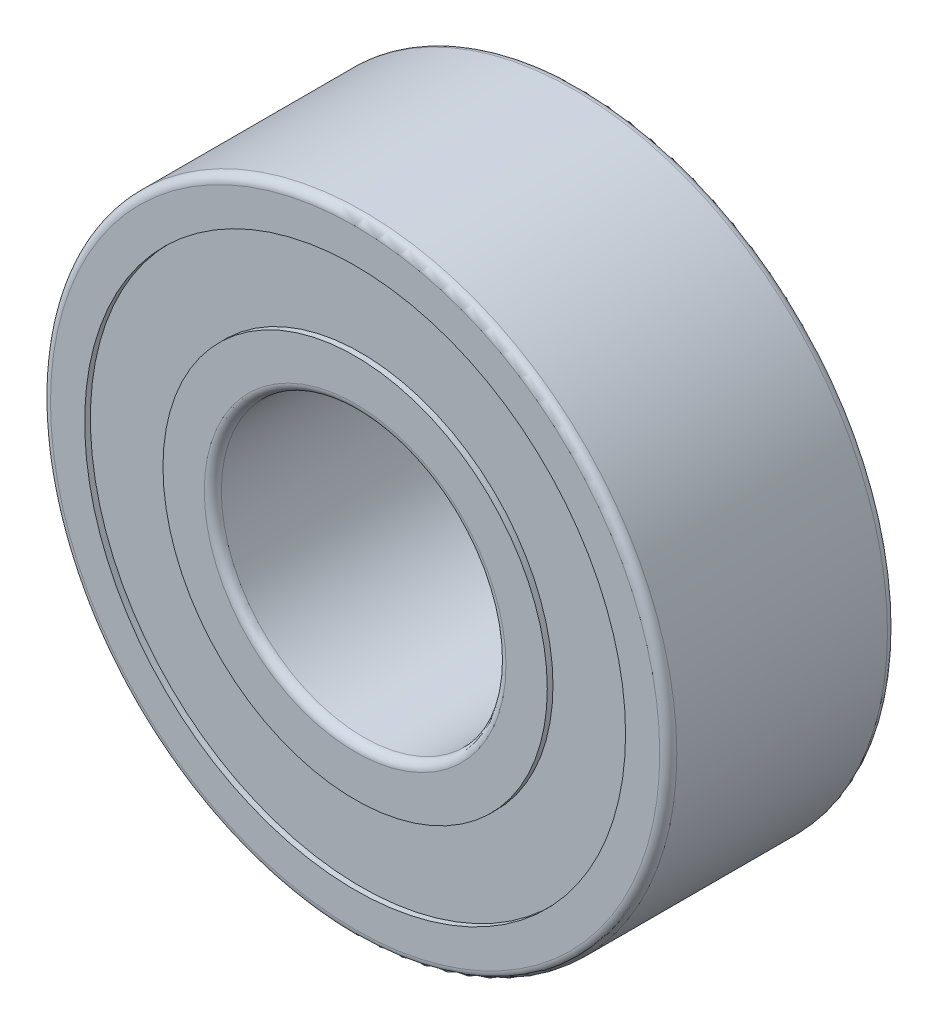
ISO-10303-21;
HEADER;
FILE_DESCRIPTION(('STEP AP214'),'2;1');
FILE_NAME('part.step','',(''),(''),'','','');
FILE_SCHEMA(('AUTOMOTIVE_DESIGN { 1 0 10303 214 1 1 1 1 }'));
ENDSEC;
DATA;
#1=APPLICATION_CONTEXT('core data for automotive mechanical design processes');
#2=APPLICATION_PROTOCOL_DEFINITION('international standard','automotive_design',2000,#1);
#3=PRODUCT_CONTEXT('',#1,'mechanical');
#4=PRODUCT('Part','Part','',(#3));
#5=PRODUCT_RELATED_PRODUCT_CATEGORY('part','',(#4));
#6=PRODUCT_DEFINITION_FORMATION('','',#4);
#7=PRODUCT_DEFINITION_CONTEXT('part definition',#1,'design');
#8=PRODUCT_DEFINITION('design','',#6,#7);
#9=PRODUCT_DEFINITION_SHAPE('','',#8);
#10=(LENGTH_UNIT() NAMED_UNIT(*) SI_UNIT(.MILLI.,.METRE.));
#11=(NAMED_UNIT(*) PLANE_ANGLE_UNIT() SI_UNIT($,.RADIAN.));
#12=(NAMED_UNIT(*) SI_UNIT($,.STERADIAN.) SOLID_ANGLE_UNIT());
#13=UNCERTAINTY_MEASURE_WITH_UNIT(LENGTH_MEASURE(1.E-05),#10,'distance_accuracy_value','');
#14=(GEOMETRIC_REPRESENTATION_CONTEXT(3) GLOBAL_UNCERTAINTY_ASSIGNED_CONTEXT((#13)) GLOBAL_UNIT_ASSIGNED_CONTEXT((#10,
#11,#12)) REPRESENTATION_CONTEXT('',''));
#15=CARTESIAN_POINT('',(0.,0.,0.));
#16=DIRECTION('',(0.,0.,1.));
#17=DIRECTION('',(1.,0.,0.));
#18=AXIS2_PLACEMENT_3D('',#15,#16,#17);
#19=CARTESIAN_POINT('',(0.,0.,-4.));
#20=DIRECTION('',(0.,0.,1.));
#21=DIRECTION('',(1.,0.,0.));
#22=AXIS2_PLACEMENT_3D('',#19,#20,#21);
#23=PLANE('',#22);
#24=CARTESIAN_POINT('',(0.,0.,-4.));
#25=DIRECTION('',(0.,0.,1.));
#26=DIRECTION('',(1.,0.,0.));
#27=AXIS2_PLACEMENT_3D('',#24,#25,#26);
#28=CIRCLE('',#27,5.3);
#29=CARTESIAN_POINT('',(5.3,0.,-4.));
#30=VERTEX_POINT('',#29);
#31=EDGE_CURVE('E62',#30,#30,#28,.T.);
#32=ORIENTED_EDGE('',*,*,#31,.T.);
#33=EDGE_LOOP('',(#32));
#34=FACE_BOUND('',#33,.T.);
#35=CARTESIAN_POINT('',(0.,0.,-4.));
#36=DIRECTION('',(0.,0.,1.));
#37=DIRECTION('',(1.,0.,0.));
#38=AXIS2_PLACEMENT_3D('',#35,#36,#37);
#39=CIRCLE('',#38,6.75);
#40=CARTESIAN_POINT('',(6.75,0.,-4.));
#41=VERTEX_POINT('',#40);
#42=EDGE_CURVE('E98',#41,#41,#39,.T.);
#43=ORIENTED_EDGE('',*,*,#42,.F.);
#44=EDGE_LOOP('',(#43));
#45=FACE_BOUND('',#44,.T.);
#46=ADVANCED_FACE('F47',(#34,#45),#23,.F.);
#47=CARTESIAN_POINT('',(0.,0.,4.));
#48=DIRECTION('',(0.,0.,1.));
#49=DIRECTION('',(1.,0.,0.));
#50=AXIS2_PLACEMENT_3D('',#47,#48,#49);
#51=PLANE('',#50);
#52=CARTESIAN_POINT('',(0.,0.,4.));
#53=DIRECTION('',(0.,0.,1.));
#54=DIRECTION('',(1.,0.,0.));
#55=AXIS2_PLACEMENT_3D('',#52,#53,#54);
#56=CIRCLE('',#55,5.3);
#57=CARTESIAN_POINT('',(5.3,0.,4.));
#58=VERTEX_POINT('',#57);
#59=EDGE_CURVE('E10',#58,#58,#56,.F.);
#60=ORIENTED_EDGE('',*,*,#59,.T.);
#61=EDGE_LOOP('',(#60));
#62=FACE_BOUND('',#61,.T.);
#63=CARTESIAN_POINT('',(0.,0.,4.));
#64=DIRECTION('',(0.,0.,1.));
#65=DIRECTION('',(1.,0.,0.));
#66=AXIS2_PLACEMENT_3D('',#63,#64,#65);
#67=CIRCLE('',#66,6.75);
#68=CARTESIAN_POINT('',(6.75,0.,4.));
#69=VERTEX_POINT('',#68);
#70=EDGE_CURVE('E82',#69,#69,#67,.T.);
#71=ORIENTED_EDGE('',*,*,#70,.T.);
#72=EDGE_LOOP('',(#71));
#73=FACE_BOUND('',#72,.T.);
#74=ADVANCED_FACE('F115',(#62,#73),#51,.T.);
#75=CARTESIAN_POINT('',(0.,0.,4.));
#76=DIRECTION('',(0.,0.,1.));
#77=DIRECTION('',(1.,0.,0.));
#78=AXIS2_PLACEMENT_3D('',#75,#76,#77);
#79=CIRCLE('',#78,10.7);
#80=CARTESIAN_POINT('',(10.7,0.,4.));
#81=VERTEX_POINT('',#80);
#82=EDGE_CURVE('E67',#81,#81,#79,.T.);
#83=ORIENTED_EDGE('',*,*,#82,.T.);
#84=EDGE_LOOP('',(#83));
#85=FACE_BOUND('',#84,.T.);
#86=CARTESIAN_POINT('',(0.,0.,4.));
#87=DIRECTION('',(0.,0.,1.));
#88=DIRECTION('',(1.,0.,0.));
#89=AXIS2_PLACEMENT_3D('',#86,#87,#88);
#90=CIRCLE('',#89,9.5);
#91=CARTESIAN_POINT('',(9.5,0.,4.));
#92=VERTEX_POINT('',#91);
#93=EDGE_CURVE('E79',#92,#92,#90,.T.);
#94=ORIENTED_EDGE('',*,*,#93,.F.);
#95=EDGE_LOOP('',(#94));
#96=FACE_BOUND('',#95,.T.);
#97=ADVANCED_FACE('F122',(#85,#96),#51,.T.);
#98=CARTESIAN_POINT('',(0.,0.,-4.));
#99=DIRECTION('',(0.,0.,1.));
#100=DIRECTION('',(1.,0.,0.));
#101=AXIS2_PLACEMENT_3D('',#98,#99,#100);
#102=CIRCLE('',#101,10.7);
#103=CARTESIAN_POINT('',(10.7,0.,-4.));
#104=VERTEX_POINT('',#103);
#105=EDGE_CURVE('E70',#104,#104,#102,.F.);
#106=ORIENTED_EDGE('',*,*,#105,.T.);
#107=EDGE_LOOP('',(#106));
#108=FACE_BOUND('',#107,.T.);
#109=CARTESIAN_POINT('',(0.,0.,-4.));
#110=DIRECTION('',(0.,0.,1.));
#111=DIRECTION('',(1.,0.,0.));
#112=AXIS2_PLACEMENT_3D('',#109,#110,#111);
#113=CIRCLE('',#112,9.5);
#114=CARTESIAN_POINT('',(9.5,0.,-4.));
#115=VERTEX_POINT('',#114);
#116=EDGE_CURVE('E92',#115,#115,#113,.T.);
#117=ORIENTED_EDGE('',*,*,#116,.T.);
#118=EDGE_LOOP('',(#117));
#119=FACE_BOUND('',#118,.T.);
#120=ADVANCED_FACE('F118',(#108,#119),#23,.F.);
#121=CARTESIAN_POINT('',(0.,0.,4.));
#122=DIRECTION('',(0.,0.,-1.));
#123=DIRECTION('',(-1.,0.,0.));
#124=AXIS2_PLACEMENT_3D('',#121,#122,#123);
#125=CYLINDRICAL_SURFACE('',#124,11.);
#126=CARTESIAN_POINT('',(0.,0.,-3.7));
#127=DIRECTION('',(0.,0.,1.));
#128=DIRECTION('',(1.,0.,0.));
#129=AXIS2_PLACEMENT_3D('',#126,#127,#128);
#130=CIRCLE('',#129,11.);
#131=CARTESIAN_POINT('',(11.,0.,-3.7));
#132=VERTEX_POINT('',#131);
#133=EDGE_CURVE('E73',#132,#132,#130,.T.);
#134=ORIENTED_EDGE('',*,*,#133,.T.);
#135=EDGE_LOOP('',(#134));
#136=FACE_BOUND('',#135,.T.);
#137=CARTESIAN_POINT('',(0.,0.,3.7));
#138=DIRECTION('',(0.,0.,1.));
#139=DIRECTION('',(1.,0.,0.));
#140=AXIS2_PLACEMENT_3D('',#137,#138,#139);
#141=CIRCLE('',#140,11.);
#142=CARTESIAN_POINT('',(11.,0.,3.7));
#143=VERTEX_POINT('',#142);
#144=EDGE_CURVE('E76',#143,#143,#141,.F.);
#145=ORIENTED_EDGE('',*,*,#144,.T.);
#146=EDGE_LOOP('',(#145));
#147=FACE_BOUND('',#146,.T.);
#148=ADVANCED_FACE('F126',(#136,#147),#125,.T.);
#149=CARTESIAN_POINT('',(0.,0.,4.));
#150=DIRECTION('',(0.,0.,-1.));
#151=DIRECTION('',(-1.,0.,0.));
#152=AXIS2_PLACEMENT_3D('',#149,#150,#151);
#153=CYLINDRICAL_SURFACE('',#152,5.);
#154=CARTESIAN_POINT('',(0.,0.,-3.7));
#155=DIRECTION('',(0.,0.,1.));
#156=DIRECTION('',(1.,0.,0.));
#157=AXIS2_PLACEMENT_3D('',#154,#155,#156);
#158=CIRCLE('',#157,5.);
#159=CARTESIAN_POINT('',(5.,0.,-3.7));
#160=VERTEX_POINT('',#159);
#161=EDGE_CURVE('E54',#160,#160,#158,.F.);
#162=ORIENTED_EDGE('',*,*,#161,.T.);
#163=EDGE_LOOP('',(#162));
#164=FACE_BOUND('',#163,.T.);
#165=CARTESIAN_POINT('',(0.,0.,3.7));
#166=DIRECTION('',(0.,0.,1.));
#167=DIRECTION('',(1.,0.,0.));
#168=AXIS2_PLACEMENT_3D('',#165,#166,#167);
#169=CIRCLE('',#168,5.);
#170=CARTESIAN_POINT('',(5.,0.,3.7));
#171=VERTEX_POINT('',#170);
#172=EDGE_CURVE('E58',#171,#171,#169,.T.);
#173=ORIENTED_EDGE('',*,*,#172,.T.);
#174=EDGE_LOOP('',(#173));
#175=FACE_BOUND('',#174,.T.);
#176=ADVANCED_FACE('F133',(#164,#175),#153,.F.);
#177=CARTESIAN_POINT('',(0.,0.,3.9));
#178=DIRECTION('',(0.,0.,1.));
#179=DIRECTION('',(1.,0.,0.));
#180=AXIS2_PLACEMENT_3D('',#177,#178,#179);
#181=CYLINDRICAL_SURFACE('',#180,9.5);
#182=ORIENTED_EDGE('',*,*,#93,.T.);
#183=EDGE_LOOP('',(#182));
#184=FACE_BOUND('',#183,.T.);
#185=CARTESIAN_POINT('',(0.,0.,3.8));
#186=DIRECTION('',(0.,0.,1.));
#187=DIRECTION('',(1.,0.,0.));
#188=AXIS2_PLACEMENT_3D('',#185,#186,#187);
#189=CIRCLE('',#188,9.5);
#190=CARTESIAN_POINT('',(9.5,0.,3.8));
#191=VERTEX_POINT('',#190);
#192=EDGE_CURVE('E85',#191,#191,#189,.T.);
#193=ORIENTED_EDGE('',*,*,#192,.F.);
#194=EDGE_LOOP('',(#193));
#195=FACE_BOUND('',#194,.T.);
#196=ADVANCED_FACE('F157',(#184,#195),#181,.F.);
#197=CARTESIAN_POINT('',(0.,0.,3.9));
#198=DIRECTION('',(0.,0.,1.));
#199=DIRECTION('',(1.,0.,0.));
#200=AXIS2_PLACEMENT_3D('',#197,#198,#199);
#201=CYLINDRICAL_SURFACE('',#200,6.75);
#202=ORIENTED_EDGE('',*,*,#70,.F.);
#203=EDGE_LOOP('',(#202));
#204=FACE_BOUND('',#203,.T.);
#205=CARTESIAN_POINT('',(0.,0.,3.8));
#206=DIRECTION('',(0.,0.,1.));
#207=DIRECTION('',(1.,0.,0.));
#208=AXIS2_PLACEMENT_3D('',#205,#206,#207);
#209=CIRCLE('',#208,6.75);
#210=CARTESIAN_POINT('',(6.75,0.,3.8));
#211=VERTEX_POINT('',#210);
#212=EDGE_CURVE('E88',#211,#211,#209,.T.);
#213=ORIENTED_EDGE('',*,*,#212,.T.);
#214=EDGE_LOOP('',(#213));
#215=FACE_BOUND('',#214,.T.);
#216=ADVANCED_FACE('F153',(#204,#215),#201,.T.);
#217=CARTESIAN_POINT('',(0.,0.,3.8));
#218=DIRECTION('',(0.,0.,-1.));
#219=DIRECTION('',(1.,0.,0.));
#220=AXIS2_PLACEMENT_3D('',#217,#218,#219);
#221=PLANE('',#220);
#222=ORIENTED_EDGE('',*,*,#192,.T.);
#223=EDGE_LOOP('',(#222));
#224=FACE_BOUND('',#223,.T.);
#225=ORIENTED_EDGE('',*,*,#212,.F.);
#226=EDGE_LOOP('',(#225));
#227=FACE_BOUND('',#226,.T.);
#228=ADVANCED_FACE('F147',(#224,#227),#221,.F.);
#229=CARTESIAN_POINT('',(0.,0.,-3.9));
#230=DIRECTION('',(0.,0.,-1.));
#231=DIRECTION('',(1.,0.,0.));
#232=AXIS2_PLACEMENT_3D('',#229,#230,#231);
#233=PLANE('',#232);
#234=CARTESIAN_POINT('',(0.,0.,-3.9));
#235=DIRECTION('',(0.,0.,1.));
#236=DIRECTION('',(1.,0.,0.));
#237=AXIS2_PLACEMENT_3D('',#234,#235,#236);
#238=CIRCLE('',#237,9.5);
#239=CARTESIAN_POINT('',(9.5,0.,-3.9));
#240=VERTEX_POINT('',#239);
#241=EDGE_CURVE('E91',#240,#240,#238,.T.);
#242=ORIENTED_EDGE('',*,*,#241,.F.);
#243=EDGE_LOOP('',(#242));
#244=FACE_BOUND('',#243,.T.);
#245=CARTESIAN_POINT('',(0.,0.,-3.9));
#246=DIRECTION('',(0.,0.,1.));
#247=DIRECTION('',(1.,0.,0.));
#248=AXIS2_PLACEMENT_3D('',#245,#246,#247);
#249=CIRCLE('',#248,6.75);
#250=CARTESIAN_POINT('',(6.75,0.,-3.9));
#251=VERTEX_POINT('',#250);
#252=EDGE_CURVE('E95',#251,#251,#249,.T.);
#253=ORIENTED_EDGE('',*,*,#252,.T.);
#254=EDGE_LOOP('',(#253));
#255=FACE_BOUND('',#254,.T.);
#256=ADVANCED_FACE('F104',(#244,#255),#233,.T.);
#257=CARTESIAN_POINT('',(0.,0.,-3.9));
#258=DIRECTION('',(0.,0.,-1.));
#259=DIRECTION('',(-1.,0.,0.));
#260=AXIS2_PLACEMENT_3D('',#257,#258,#259);
#261=CYLINDRICAL_SURFACE('',#260,9.5);
#262=ORIENTED_EDGE('',*,*,#241,.T.);
#263=EDGE_LOOP('',(#262));
#264=FACE_BOUND('',#263,.T.);
#265=ORIENTED_EDGE('',*,*,#116,.F.);
#266=EDGE_LOOP('',(#265));
#267=FACE_BOUND('',#266,.T.);
#268=ADVANCED_FACE('F110',(#264,#267),#261,.F.);
#269=CARTESIAN_POINT('',(0.,0.,-3.9));
#270=DIRECTION('',(0.,0.,-1.));
#271=DIRECTION('',(-1.,0.,0.));
#272=AXIS2_PLACEMENT_3D('',#269,#270,#271);
#273=CYLINDRICAL_SURFACE('',#272,6.75);
#274=ORIENTED_EDGE('',*,*,#252,.F.);
#275=EDGE_LOOP('',(#274));
#276=FACE_BOUND('',#275,.T.);
#277=ORIENTED_EDGE('',*,*,#42,.T.);
#278=EDGE_LOOP('',(#277));
#279=FACE_BOUND('',#278,.T.);
#280=ADVANCED_FACE('F106',(#276,#279),#273,.T.);
#281=CARTESIAN_POINT('',(0.,0.,-3.7));
#282=DIRECTION('',(0.,0.,1.));
#283=DIRECTION('',(1.,0.,0.));
#284=AXIS2_PLACEMENT_3D('',#281,#282,#283);
#285=TOROIDAL_SURFACE('',#284,10.7,0.3);
#286=ORIENTED_EDGE('',*,*,#105,.F.);
#287=EDGE_LOOP('',(#286));
#288=FACE_BOUND('',#287,.T.);
#289=ORIENTED_EDGE('',*,*,#133,.F.);
#290=EDGE_LOOP('',(#289));
#291=FACE_BOUND('',#290,.T.);
#292=ADVANCED_FACE('F109',(#288,#291),#285,.T.);
#293=CARTESIAN_POINT('',(0.,0.,3.7));
#294=DIRECTION('',(0.,0.,1.));
#295=DIRECTION('',(1.,0.,0.));
#296=AXIS2_PLACEMENT_3D('',#293,#294,#295);
#297=TOROIDAL_SURFACE('',#296,10.7,0.3);
#298=ORIENTED_EDGE('',*,*,#144,.F.);
#299=EDGE_LOOP('',(#298));
#300=FACE_BOUND('',#299,.T.);
#301=ORIENTED_EDGE('',*,*,#82,.F.);
#302=EDGE_LOOP('',(#301));
#303=FACE_BOUND('',#302,.T.);
#304=ADVANCED_FACE('F175',(#300,#303),#297,.T.);
#305=CARTESIAN_POINT('',(0.,0.,-3.7));
#306=DIRECTION('',(0.,0.,1.));
#307=DIRECTION('',(1.,0.,0.));
#308=AXIS2_PLACEMENT_3D('',#305,#306,#307);
#309=TOROIDAL_SURFACE('',#308,5.3,0.3);
#310=ORIENTED_EDGE('',*,*,#161,.F.);
#311=EDGE_LOOP('',(#310));
#312=FACE_BOUND('',#311,.T.);
#313=ORIENTED_EDGE('',*,*,#31,.F.);
#314=EDGE_LOOP('',(#313));
#315=FACE_BOUND('',#314,.T.);
#316=ADVANCED_FACE('F170',(#312,#315),#309,.T.);
#317=CARTESIAN_POINT('',(0.,0.,3.7));
#318=DIRECTION('',(0.,0.,1.));
#319=DIRECTION('',(1.,0.,0.));
#320=AXIS2_PLACEMENT_3D('',#317,#318,#319);
#321=TOROIDAL_SURFACE('',#320,5.3,0.3);
#322=ORIENTED_EDGE('',*,*,#59,.F.);
#323=EDGE_LOOP('',(#322));
#324=FACE_BOUND('',#323,.T.);
#325=ORIENTED_EDGE('',*,*,#172,.F.);
#326=EDGE_LOOP('',(#325));
#327=FACE_BOUND('',#326,.T.);
#328=ADVANCED_FACE('F49',(#324,#327),#321,.T.);
#329=CLOSED_SHELL('',(#46,#74,#97,#120,#148,#176,#196,#216,#228,#256,#268,#280,#292,#304,#316,#328));
#330=MANIFOLD_SOLID_BREP('B2',#329);
#331=ADVANCED_BREP_SHAPE_REPRESENTATION('',(#18,#330),#14);
#332=SHAPE_DEFINITION_REPRESENTATION(#9,#331);
ENDSEC;
END-ISO-10303-21;
